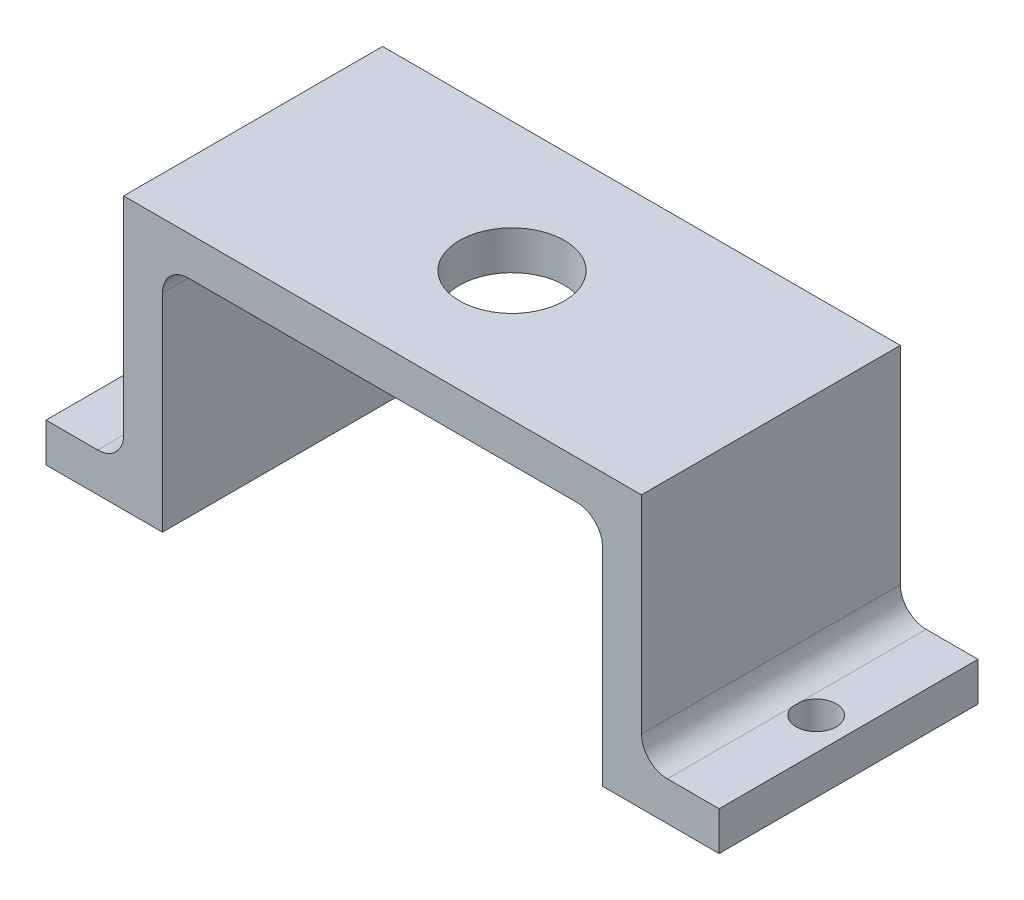
ISO-10303-21;
HEADER;
FILE_DESCRIPTION(('STEP AP214'),'2;1');
FILE_NAME('part.step','',(''),(''),'','','');
FILE_SCHEMA(('AUTOMOTIVE_DESIGN { 1 0 10303 214 1 1 1 1 }'));
ENDSEC;
DATA;
#1=APPLICATION_CONTEXT('core data for automotive mechanical design processes');
#2=APPLICATION_PROTOCOL_DEFINITION('international standard','automotive_design',2000,#1);
#3=PRODUCT_CONTEXT('',#1,'mechanical');
#4=PRODUCT('Part','Part','',(#3));
#5=PRODUCT_RELATED_PRODUCT_CATEGORY('part','',(#4));
#6=PRODUCT_DEFINITION_FORMATION('','',#4);
#7=PRODUCT_DEFINITION_CONTEXT('part definition',#1,'design');
#8=PRODUCT_DEFINITION('design','',#6,#7);
#9=PRODUCT_DEFINITION_SHAPE('','',#8);
#10=(LENGTH_UNIT() NAMED_UNIT(*) SI_UNIT(.MILLI.,.METRE.));
#11=(NAMED_UNIT(*) PLANE_ANGLE_UNIT() SI_UNIT($,.RADIAN.));
#12=(NAMED_UNIT(*) SI_UNIT($,.STERADIAN.) SOLID_ANGLE_UNIT());
#13=UNCERTAINTY_MEASURE_WITH_UNIT(LENGTH_MEASURE(1.E-05),#10,'distance_accuracy_value','');
#14=(GEOMETRIC_REPRESENTATION_CONTEXT(3) GLOBAL_UNCERTAINTY_ASSIGNED_CONTEXT((#13)) GLOBAL_UNIT_ASSIGNED_CONTEXT((#10,
#11,#12)) REPRESENTATION_CONTEXT('',''));
#15=CARTESIAN_POINT('',(0.,0.,0.));
#16=DIRECTION('',(0.,0.,1.));
#17=DIRECTION('',(1.,0.,0.));
#18=AXIS2_PLACEMENT_3D('',#15,#16,#17);
#19=CARTESIAN_POINT('',(-17.,9.13588483146066,20.));
#20=DIRECTION('',(-1.,0.,0.));
#21=DIRECTION('',(0.,-1.,0.));
#22=AXIS2_PLACEMENT_3D('',#19,#20,#21);
#23=PLANE('',#22);
#24=DIRECTION('',(0.,1.,0.));
#25=VECTOR('',#24,1.);
#26=CARTESIAN_POINT('',(-17.,9.13588483146066,0.));
#27=LINE('',#26,#25);
#28=CARTESIAN_POINT('',(-17.,-8.86411516853933,0.));
#29=VERTEX_POINT('',#28);
#30=CARTESIAN_POINT('',(-17.,7.13588483146066,0.));
#31=VERTEX_POINT('',#30);
#32=EDGE_CURVE('E251',#29,#31,#27,.T.);
#33=ORIENTED_EDGE('',*,*,#32,.T.);
#34=DIRECTION('',(0.,0.,-1.));
#35=VECTOR('',#34,1.);
#36=CARTESIAN_POINT('',(-17.,7.13588483146066,20.));
#37=LINE('',#36,#35);
#38=CARTESIAN_POINT('',(-17.,7.13588483146066,20.));
#39=VERTEX_POINT('',#38);
#40=EDGE_CURVE('E299',#31,#39,#37,.F.);
#41=ORIENTED_EDGE('',*,*,#40,.T.);
#42=DIRECTION('',(0.,1.,0.));
#43=VECTOR('',#42,1.);
#44=CARTESIAN_POINT('',(-17.,9.13588483146066,20.));
#45=LINE('',#44,#43);
#46=CARTESIAN_POINT('',(-17.,-8.86411516853933,20.));
#47=VERTEX_POINT('',#46);
#48=EDGE_CURVE('E274',#47,#39,#45,.T.);
#49=ORIENTED_EDGE('',*,*,#48,.F.);
#50=DIRECTION('',(0.,0.,-1.));
#51=VECTOR('',#50,1.);
#52=CARTESIAN_POINT('',(-17.,-8.86411516853933,20.));
#53=LINE('',#52,#51);
#54=EDGE_CURVE('E250',#47,#29,#53,.T.);
#55=ORIENTED_EDGE('',*,*,#54,.T.);
#56=EDGE_LOOP('',(#33,#41,#49,#55));
#57=FACE_BOUND('',#56,.T.);
#58=ADVANCED_FACE('F33',(#57),#23,.F.);
#59=CARTESIAN_POINT('',(17.,9.13588483146066,20.));
#60=DIRECTION('',(0.,1.,0.));
#61=DIRECTION('',(-1.,0.,0.));
#62=AXIS2_PLACEMENT_3D('',#59,#60,#61);
#63=PLANE('',#62);
#64=CARTESIAN_POINT('',(0.,9.13588483146066,10.));
#65=DIRECTION('',(0.,1.,0.));
#66=DIRECTION('',(-1.,0.,0.));
#67=AXIS2_PLACEMENT_3D('',#64,#65,#66);
#68=CIRCLE('',#67,4.05);
#69=CARTESIAN_POINT('',(-4.05,9.13588483146066,10.));
#70=VERTEX_POINT('',#69);
#71=EDGE_CURVE('E255',#70,#70,#68,.T.);
#72=ORIENTED_EDGE('',*,*,#71,.T.);
#73=EDGE_LOOP('',(#72));
#74=FACE_BOUND('',#73,.T.);
#75=DIRECTION('',(1.,0.,0.));
#76=VECTOR('',#75,1.);
#77=CARTESIAN_POINT('',(17.,9.13588483146066,20.));
#78=LINE('',#77,#76);
#79=CARTESIAN_POINT('',(-15.,9.13588483146066,20.));
#80=VERTEX_POINT('',#79);
#81=CARTESIAN_POINT('',(15.,9.13588483146066,20.));
#82=VERTEX_POINT('',#81);
#83=EDGE_CURVE('E523',#80,#82,#78,.T.);
#84=ORIENTED_EDGE('',*,*,#83,.F.);
#85=DIRECTION('',(0.,0.,-1.));
#86=VECTOR('',#85,1.);
#87=CARTESIAN_POINT('',(-15.,9.13588483146066,0.));
#88=LINE('',#87,#86);
#89=CARTESIAN_POINT('',(-15.,9.13588483146066,0.));
#90=VERTEX_POINT('',#89);
#91=EDGE_CURVE('E296',#80,#90,#88,.T.);
#92=ORIENTED_EDGE('',*,*,#91,.T.);
#93=DIRECTION('',(1.,0.,0.));
#94=VECTOR('',#93,1.);
#95=CARTESIAN_POINT('',(17.,9.13588483146066,0.));
#96=LINE('',#95,#94);
#97=CARTESIAN_POINT('',(15.,9.13588483146066,0.));
#98=VERTEX_POINT('',#97);
#99=EDGE_CURVE('E254',#90,#98,#96,.T.);
#100=ORIENTED_EDGE('',*,*,#99,.T.);
#101=DIRECTION('',(0.,0.,-1.));
#102=VECTOR('',#101,1.);
#103=CARTESIAN_POINT('',(15.,9.13588483146066,20.));
#104=LINE('',#103,#102);
#105=EDGE_CURVE('E294',#98,#82,#104,.F.);
#106=ORIENTED_EDGE('',*,*,#105,.T.);
#107=EDGE_LOOP('',(#84,#92,#100,#106));
#108=FACE_BOUND('',#107,.T.);
#109=ADVANCED_FACE('F350',(#74,#108),#63,.F.);
#110=CARTESIAN_POINT('',(17.,-8.86411516853933,20.));
#111=DIRECTION('',(1.,0.,0.));
#112=DIRECTION('',(0.,1.,0.));
#113=AXIS2_PLACEMENT_3D('',#110,#111,#112);
#114=PLANE('',#113);
#115=DIRECTION('',(0.,-1.,0.));
#116=VECTOR('',#115,1.);
#117=CARTESIAN_POINT('',(17.,-8.86411516853933,20.));
#118=LINE('',#117,#116);
#119=CARTESIAN_POINT('',(17.,7.13588483146066,20.));
#120=VERTEX_POINT('',#119);
#121=CARTESIAN_POINT('',(17.,-8.86411516853933,20.));
#122=VERTEX_POINT('',#121);
#123=EDGE_CURVE('E308',#120,#122,#118,.T.);
#124=ORIENTED_EDGE('',*,*,#123,.F.);
#125=DIRECTION('',(0.,0.,-1.));
#126=VECTOR('',#125,1.);
#127=CARTESIAN_POINT('',(17.,7.13588483146066,0.));
#128=LINE('',#127,#126);
#129=CARTESIAN_POINT('',(17.,7.13588483146066,0.));
#130=VERTEX_POINT('',#129);
#131=EDGE_CURVE('E182',#120,#130,#128,.T.);
#132=ORIENTED_EDGE('',*,*,#131,.T.);
#133=DIRECTION('',(0.,-1.,0.));
#134=VECTOR('',#133,1.);
#135=CARTESIAN_POINT('',(17.,-8.86411516853933,0.));
#136=LINE('',#135,#134);
#137=CARTESIAN_POINT('',(17.,-8.86411516853933,0.));
#138=VERTEX_POINT('',#137);
#139=EDGE_CURVE('E258',#130,#138,#136,.T.);
#140=ORIENTED_EDGE('',*,*,#139,.T.);
#141=DIRECTION('',(0.,0.,-1.));
#142=VECTOR('',#141,1.);
#143=CARTESIAN_POINT('',(17.,-8.86411516853933,20.));
#144=LINE('',#143,#142);
#145=EDGE_CURVE('E291',#122,#138,#144,.T.);
#146=ORIENTED_EDGE('',*,*,#145,.F.);
#147=EDGE_LOOP('',(#124,#132,#140,#146));
#148=FACE_BOUND('',#147,.T.);
#149=ADVANCED_FACE('F306',(#148),#114,.F.);
#150=CARTESIAN_POINT('',(26.,-8.86411516853933,20.));
#151=DIRECTION('',(0.,1.,0.));
#152=DIRECTION('',(-1.,0.,0.));
#153=AXIS2_PLACEMENT_3D('',#150,#151,#152);
#154=PLANE('',#153);
#155=CARTESIAN_POINT('',(23.5,-8.86411516853933,10.));
#156=DIRECTION('',(0.,1.,0.));
#157=DIRECTION('',(-1.,0.,0.));
#158=AXIS2_PLACEMENT_3D('',#155,#156,#157);
#159=CIRCLE('',#158,1.55);
#160=CARTESIAN_POINT('',(21.95,-8.86411516853933,10.));
#161=VERTEX_POINT('',#160);
#162=EDGE_CURVE('E169',#161,#161,#159,.T.);
#163=ORIENTED_EDGE('',*,*,#162,.T.);
#164=EDGE_LOOP('',(#163));
#165=FACE_BOUND('',#164,.T.);
#166=DIRECTION('',(1.,0.,0.));
#167=VECTOR('',#166,1.);
#168=CARTESIAN_POINT('',(26.,-8.86411516853933,0.));
#169=LINE('',#168,#167);
#170=CARTESIAN_POINT('',(26.,-8.86411516853933,0.));
#171=VERTEX_POINT('',#170);
#172=EDGE_CURVE('E260',#138,#171,#169,.T.);
#173=ORIENTED_EDGE('',*,*,#172,.T.);
#174=DIRECTION('',(0.,0.,-1.));
#175=VECTOR('',#174,1.);
#176=CARTESIAN_POINT('',(26.,-8.86411516853933,20.));
#177=LINE('',#176,#175);
#178=CARTESIAN_POINT('',(26.,-8.86411516853933,20.));
#179=VERTEX_POINT('',#178);
#180=EDGE_CURVE('E288',#179,#171,#177,.T.);
#181=ORIENTED_EDGE('',*,*,#180,.F.);
#182=DIRECTION('',(1.,0.,0.));
#183=VECTOR('',#182,1.);
#184=CARTESIAN_POINT('',(26.,-8.86411516853933,20.));
#185=LINE('',#184,#183);
#186=EDGE_CURVE('E325',#122,#179,#185,.T.);
#187=ORIENTED_EDGE('',*,*,#186,.F.);
#188=ORIENTED_EDGE('',*,*,#145,.T.);
#189=EDGE_LOOP('',(#173,#181,#187,#188));
#190=FACE_BOUND('',#189,.T.);
#191=ADVANCED_FACE('F317',(#165,#190),#154,.F.);
#192=CARTESIAN_POINT('',(26.,-5.86411516853933,20.));
#193=DIRECTION('',(-1.,0.,0.));
#194=DIRECTION('',(0.,0.,1.));
#195=AXIS2_PLACEMENT_3D('',#192,#193,#194);
#196=PLANE('',#195);
#197=DIRECTION('',(0.,1.,0.));
#198=VECTOR('',#197,1.);
#199=CARTESIAN_POINT('',(26.,-5.86411516853933,0.));
#200=LINE('',#199,#198);
#201=CARTESIAN_POINT('',(26.,-5.86411516853933,0.));
#202=VERTEX_POINT('',#201);
#203=EDGE_CURVE('E262',#171,#202,#200,.T.);
#204=ORIENTED_EDGE('',*,*,#203,.T.);
#205=DIRECTION('',(0.,0.,-1.));
#206=VECTOR('',#205,1.);
#207=CARTESIAN_POINT('',(26.,-5.86411516853933,20.));
#208=LINE('',#207,#206);
#209=CARTESIAN_POINT('',(26.,-5.86411516853933,20.));
#210=VERTEX_POINT('',#209);
#211=EDGE_CURVE('E285',#210,#202,#208,.T.);
#212=ORIENTED_EDGE('',*,*,#211,.F.);
#213=DIRECTION('',(0.,1.,0.));
#214=VECTOR('',#213,1.);
#215=CARTESIAN_POINT('',(26.,-5.86411516853933,20.));
#216=LINE('',#215,#214);
#217=EDGE_CURVE('E323',#179,#210,#216,.T.);
#218=ORIENTED_EDGE('',*,*,#217,.F.);
#219=ORIENTED_EDGE('',*,*,#180,.T.);
#220=EDGE_LOOP('',(#204,#212,#218,#219));
#221=FACE_BOUND('',#220,.T.);
#222=ADVANCED_FACE('F321',(#221),#196,.F.);
#223=CARTESIAN_POINT('',(20.,-5.86411516853933,20.));
#224=DIRECTION('',(0.,-1.,0.));
#225=DIRECTION('',(0.,0.,-1.));
#226=AXIS2_PLACEMENT_3D('',#223,#224,#225);
#227=PLANE('',#226);
#228=DIRECTION('',(0.,0.,-1.));
#229=VECTOR('',#228,1.);
#230=CARTESIAN_POINT('',(22.,-5.86411516853933,20.));
#231=LINE('',#230,#229);
#232=CARTESIAN_POINT('',(22.,-5.86411516853933,0.));
#233=VERTEX_POINT('',#232);
#234=CARTESIAN_POINT('',(22.,-5.86411516853933,9.60948751620467));
#235=VERTEX_POINT('',#234);
#236=EDGE_CURVE('E161',#233,#235,#231,.F.);
#237=ORIENTED_EDGE('',*,*,#236,.T.);
#238=CARTESIAN_POINT('',(23.5,-5.86411516853933,10.));
#239=DIRECTION('',(0.,1.,0.));
#240=DIRECTION('',(0.,0.,1.));
#241=AXIS2_PLACEMENT_3D('',#238,#239,#240);
#242=CIRCLE('',#241,1.55);
#243=CARTESIAN_POINT('',(22.,-5.86411516853933,10.3905124837953));
#244=VERTEX_POINT('',#243);
#245=EDGE_CURVE('E168',#244,#235,#242,.T.);
#246=ORIENTED_EDGE('',*,*,#245,.F.);
#247=CARTESIAN_POINT('',(22.,-5.86411516853933,20.));
#248=VERTEX_POINT('',#247);
#249=EDGE_CURVE('E162',#244,#248,#231,.F.);
#250=ORIENTED_EDGE('',*,*,#249,.T.);
#251=DIRECTION('',(-1.,0.,0.));
#252=VECTOR('',#251,1.);
#253=CARTESIAN_POINT('',(20.,-5.86411516853933,20.));
#254=LINE('',#253,#252);
#255=EDGE_CURVE('E324',#210,#248,#254,.T.);
#256=ORIENTED_EDGE('',*,*,#255,.F.);
#257=ORIENTED_EDGE('',*,*,#211,.T.);
#258=DIRECTION('',(-1.,0.,0.));
#259=VECTOR('',#258,1.);
#260=CARTESIAN_POINT('',(20.,-5.86411516853933,0.));
#261=LINE('',#260,#259);
#262=EDGE_CURVE('E264',#202,#233,#261,.T.);
#263=ORIENTED_EDGE('',*,*,#262,.T.);
#264=EDGE_LOOP('',(#237,#246,#250,#256,#257,#263));
#265=FACE_BOUND('',#264,.T.);
#266=ADVANCED_FACE('F172',(#265),#227,.F.);
#267=CARTESIAN_POINT('',(20.,12.1358848314607,20.));
#268=DIRECTION('',(-1.,0.,0.));
#269=DIRECTION('',(0.,-1.,0.));
#270=AXIS2_PLACEMENT_3D('',#267,#268,#269);
#271=PLANE('',#270);
#272=DIRECTION('',(0.,1.,0.));
#273=VECTOR('',#272,1.);
#274=CARTESIAN_POINT('',(20.,12.1358848314607,20.));
#275=LINE('',#274,#273);
#276=CARTESIAN_POINT('',(20.,-3.86411516853933,20.));
#277=VERTEX_POINT('',#276);
#278=CARTESIAN_POINT('',(20.,12.1358848314607,20.));
#279=VERTEX_POINT('',#278);
#280=EDGE_CURVE('E327',#277,#279,#275,.T.);
#281=ORIENTED_EDGE('',*,*,#280,.F.);
#282=DIRECTION('',(0.,0.,-1.));
#283=VECTOR('',#282,1.);
#284=CARTESIAN_POINT('',(20.,-3.86411516853933,0.));
#285=LINE('',#284,#283);
#286=CARTESIAN_POINT('',(20.,-3.86411516853933,0.));
#287=VERTEX_POINT('',#286);
#288=EDGE_CURVE('E180',#277,#287,#285,.T.);
#289=ORIENTED_EDGE('',*,*,#288,.T.);
#290=DIRECTION('',(0.,1.,0.));
#291=VECTOR('',#290,1.);
#292=CARTESIAN_POINT('',(20.,12.1358848314607,0.));
#293=LINE('',#292,#291);
#294=CARTESIAN_POINT('',(20.,12.1358848314607,0.));
#295=VERTEX_POINT('',#294);
#296=EDGE_CURVE('E266',#287,#295,#293,.T.);
#297=ORIENTED_EDGE('',*,*,#296,.T.);
#298=DIRECTION('',(0.,0.,-1.));
#299=VECTOR('',#298,1.);
#300=CARTESIAN_POINT('',(20.,12.1358848314607,20.));
#301=LINE('',#300,#299);
#302=EDGE_CURVE('E282',#279,#295,#301,.T.);
#303=ORIENTED_EDGE('',*,*,#302,.F.);
#304=EDGE_LOOP('',(#281,#289,#297,#303));
#305=FACE_BOUND('',#304,.T.);
#306=ADVANCED_FACE('F339',(#305),#271,.F.);
#307=CARTESIAN_POINT('',(-20.,12.1358848314607,20.));
#308=DIRECTION('',(0.,-1.,0.));
#309=DIRECTION('',(0.,0.,-1.));
#310=AXIS2_PLACEMENT_3D('',#307,#308,#309);
#311=PLANE('',#310);
#312=CARTESIAN_POINT('',(0.,12.1358848314607,10.));
#313=DIRECTION('',(0.,1.,0.));
#314=DIRECTION('',(0.,0.,1.));
#315=AXIS2_PLACEMENT_3D('',#312,#313,#314);
#316=CIRCLE('',#315,4.05);
#317=CARTESIAN_POINT('',(0.,12.1358848314607,14.05));
#318=VERTEX_POINT('',#317);
#319=EDGE_CURVE('E517',#318,#318,#316,.T.);
#320=ORIENTED_EDGE('',*,*,#319,.F.);
#321=EDGE_LOOP('',(#320));
#322=FACE_BOUND('',#321,.T.);
#323=DIRECTION('',(-1.,0.,0.));
#324=VECTOR('',#323,1.);
#325=CARTESIAN_POINT('',(-20.,12.1358848314607,0.));
#326=LINE('',#325,#324);
#327=CARTESIAN_POINT('',(-20.,12.1358848314607,0.));
#328=VERTEX_POINT('',#327);
#329=EDGE_CURVE('E227',#295,#328,#326,.T.);
#330=ORIENTED_EDGE('',*,*,#329,.T.);
#331=DIRECTION('',(0.,0.,-1.));
#332=VECTOR('',#331,1.);
#333=CARTESIAN_POINT('',(-20.,12.1358848314607,20.));
#334=LINE('',#333,#332);
#335=CARTESIAN_POINT('',(-20.,12.1358848314607,20.));
#336=VERTEX_POINT('',#335);
#337=EDGE_CURVE('E226',#336,#328,#334,.T.);
#338=ORIENTED_EDGE('',*,*,#337,.F.);
#339=DIRECTION('',(-1.,0.,0.));
#340=VECTOR('',#339,1.);
#341=CARTESIAN_POINT('',(-20.,12.1358848314607,20.));
#342=LINE('',#341,#340);
#343=EDGE_CURVE('E245',#279,#336,#342,.T.);
#344=ORIENTED_EDGE('',*,*,#343,.F.);
#345=ORIENTED_EDGE('',*,*,#302,.T.);
#346=EDGE_LOOP('',(#330,#338,#344,#345));
#347=FACE_BOUND('',#346,.T.);
#348=ADVANCED_FACE('F336',(#322,#347),#311,.F.);
#349=CARTESIAN_POINT('',(-20.,-5.86411516853933,20.));
#350=DIRECTION('',(1.,0.,0.));
#351=DIRECTION('',(0.,0.,-1.));
#352=AXIS2_PLACEMENT_3D('',#349,#350,#351);
#353=PLANE('',#352);
#354=DIRECTION('',(0.,-1.,0.));
#355=VECTOR('',#354,1.);
#356=CARTESIAN_POINT('',(-20.,-5.86411516853933,0.));
#357=LINE('',#356,#355);
#358=CARTESIAN_POINT('',(-20.,-3.86411516853933,0.));
#359=VERTEX_POINT('',#358);
#360=EDGE_CURVE('E219',#328,#359,#357,.T.);
#361=ORIENTED_EDGE('',*,*,#360,.T.);
#362=DIRECTION('',(0.,0.,-1.));
#363=VECTOR('',#362,1.);
#364=CARTESIAN_POINT('',(-20.,-3.86411516853933,20.));
#365=LINE('',#364,#363);
#366=CARTESIAN_POINT('',(-20.,-3.86411516853933,20.));
#367=VERTEX_POINT('',#366);
#368=EDGE_CURVE('E194',#359,#367,#365,.F.);
#369=ORIENTED_EDGE('',*,*,#368,.T.);
#370=DIRECTION('',(0.,-1.,0.));
#371=VECTOR('',#370,1.);
#372=CARTESIAN_POINT('',(-20.,-5.86411516853933,20.));
#373=LINE('',#372,#371);
#374=EDGE_CURVE('E236',#336,#367,#373,.T.);
#375=ORIENTED_EDGE('',*,*,#374,.F.);
#376=ORIENTED_EDGE('',*,*,#337,.T.);
#377=EDGE_LOOP('',(#361,#369,#375,#376));
#378=FACE_BOUND('',#377,.T.);
#379=ADVANCED_FACE('F224',(#378),#353,.F.);
#380=CARTESIAN_POINT('',(-26.,-5.86411516853933,20.));
#381=DIRECTION('',(0.,-1.,0.));
#382=DIRECTION('',(0.,0.,-1.));
#383=AXIS2_PLACEMENT_3D('',#380,#381,#382);
#384=PLANE('',#383);
#385=DIRECTION('',(0.,0.,-1.));
#386=VECTOR('',#385,1.);
#387=CARTESIAN_POINT('',(-22.,-5.86411516853933,0.));
#388=LINE('',#387,#386);
#389=CARTESIAN_POINT('',(-22.,-5.86411516853933,20.));
#390=VERTEX_POINT('',#389);
#391=CARTESIAN_POINT('',(-22.,-5.86411516853933,10.3905124837953));
#392=VERTEX_POINT('',#391);
#393=EDGE_CURVE('E187',#390,#392,#388,.T.);
#394=ORIENTED_EDGE('',*,*,#393,.T.);
#395=CARTESIAN_POINT('',(-23.5,-5.86411516853933,10.));
#396=DIRECTION('',(0.,1.,0.));
#397=DIRECTION('',(0.,0.,1.));
#398=AXIS2_PLACEMENT_3D('',#395,#396,#397);
#399=CIRCLE('',#398,1.55);
#400=CARTESIAN_POINT('',(-22.,-5.86411516853933,9.6094875162047));
#401=VERTEX_POINT('',#400);
#402=EDGE_CURVE('E510',#401,#392,#399,.T.);
#403=ORIENTED_EDGE('',*,*,#402,.F.);
#404=CARTESIAN_POINT('',(-22.,-5.86411516853933,0.));
#405=VERTEX_POINT('',#404);
#406=EDGE_CURVE('E185',#401,#405,#388,.T.);
#407=ORIENTED_EDGE('',*,*,#406,.T.);
#408=DIRECTION('',(-1.,0.,0.));
#409=VECTOR('',#408,1.);
#410=CARTESIAN_POINT('',(-26.,-5.86411516853933,0.));
#411=LINE('',#410,#409);
#412=CARTESIAN_POINT('',(-26.,-5.86411516853933,0.));
#413=VERTEX_POINT('',#412);
#414=EDGE_CURVE('E221',#405,#413,#411,.T.);
#415=ORIENTED_EDGE('',*,*,#414,.T.);
#416=DIRECTION('',(0.,0.,-1.));
#417=VECTOR('',#416,1.);
#418=CARTESIAN_POINT('',(-26.,-5.86411516853933,20.));
#419=LINE('',#418,#417);
#420=CARTESIAN_POINT('',(-26.,-5.86411516853933,20.));
#421=VERTEX_POINT('',#420);
#422=EDGE_CURVE('E239',#421,#413,#419,.T.);
#423=ORIENTED_EDGE('',*,*,#422,.F.);
#424=DIRECTION('',(-1.,0.,0.));
#425=VECTOR('',#424,1.);
#426=CARTESIAN_POINT('',(-26.,-5.86411516853933,20.));
#427=LINE('',#426,#425);
#428=EDGE_CURVE('E234',#390,#421,#427,.T.);
#429=ORIENTED_EDGE('',*,*,#428,.F.);
#430=EDGE_LOOP('',(#394,#403,#407,#415,#423,#429));
#431=FACE_BOUND('',#430,.T.);
#432=ADVANCED_FACE('F237',(#431),#384,.F.);
#433=CARTESIAN_POINT('',(-26.,-8.86411516853933,20.));
#434=DIRECTION('',(1.,0.,0.));
#435=DIRECTION('',(0.,0.,-1.));
#436=AXIS2_PLACEMENT_3D('',#433,#434,#435);
#437=PLANE('',#436);
#438=DIRECTION('',(0.,-1.,0.));
#439=VECTOR('',#438,1.);
#440=CARTESIAN_POINT('',(-26.,-8.86411516853933,0.));
#441=LINE('',#440,#439);
#442=CARTESIAN_POINT('',(-26.,-8.86411516853933,0.));
#443=VERTEX_POINT('',#442);
#444=EDGE_CURVE('E270',#413,#443,#441,.T.);
#445=ORIENTED_EDGE('',*,*,#444,.T.);
#446=DIRECTION('',(0.,0.,-1.));
#447=VECTOR('',#446,1.);
#448=CARTESIAN_POINT('',(-26.,-8.86411516853933,20.));
#449=LINE('',#448,#447);
#450=CARTESIAN_POINT('',(-26.,-8.86411516853933,20.));
#451=VERTEX_POINT('',#450);
#452=EDGE_CURVE('E277',#451,#443,#449,.T.);
#453=ORIENTED_EDGE('',*,*,#452,.F.);
#454=DIRECTION('',(0.,-1.,0.));
#455=VECTOR('',#454,1.);
#456=CARTESIAN_POINT('',(-26.,-8.86411516853933,20.));
#457=LINE('',#456,#455);
#458=EDGE_CURVE('E241',#421,#451,#457,.T.);
#459=ORIENTED_EDGE('',*,*,#458,.F.);
#460=ORIENTED_EDGE('',*,*,#422,.T.);
#461=EDGE_LOOP('',(#445,#453,#459,#460));
#462=FACE_BOUND('',#461,.T.);
#463=ADVANCED_FACE('F395',(#462),#437,.F.);
#464=CARTESIAN_POINT('',(-17.,-8.86411516853933,20.));
#465=DIRECTION('',(0.,1.,0.));
#466=DIRECTION('',(-1.,0.,0.));
#467=AXIS2_PLACEMENT_3D('',#464,#465,#466);
#468=PLANE('',#467);
#469=CARTESIAN_POINT('',(-23.5,-8.86411516853933,10.));
#470=DIRECTION('',(0.,1.,0.));
#471=DIRECTION('',(-1.,0.,0.));
#472=AXIS2_PLACEMENT_3D('',#469,#470,#471);
#473=CIRCLE('',#472,1.55);
#474=CARTESIAN_POINT('',(-25.05,-8.86411516853933,10.));
#475=VERTEX_POINT('',#474);
#476=EDGE_CURVE('E514',#475,#475,#473,.T.);
#477=ORIENTED_EDGE('',*,*,#476,.T.);
#478=EDGE_LOOP('',(#477));
#479=FACE_BOUND('',#478,.T.);
#480=DIRECTION('',(1.,0.,0.));
#481=VECTOR('',#480,1.);
#482=CARTESIAN_POINT('',(-17.,-8.86411516853933,0.));
#483=LINE('',#482,#481);
#484=EDGE_CURVE('E272',#443,#29,#483,.T.);
#485=ORIENTED_EDGE('',*,*,#484,.T.);
#486=ORIENTED_EDGE('',*,*,#54,.F.);
#487=DIRECTION('',(1.,0.,0.));
#488=VECTOR('',#487,1.);
#489=CARTESIAN_POINT('',(-17.,-8.86411516853933,20.));
#490=LINE('',#489,#488);
#491=EDGE_CURVE('E243',#451,#47,#490,.T.);
#492=ORIENTED_EDGE('',*,*,#491,.F.);
#493=ORIENTED_EDGE('',*,*,#452,.T.);
#494=EDGE_LOOP('',(#485,#486,#492,#493));
#495=FACE_BOUND('',#494,.T.);
#496=ADVANCED_FACE('F390',(#479,#495),#468,.F.);
#497=CARTESIAN_POINT('',(0.,0.,20.));
#498=DIRECTION('',(0.,0.,-1.));
#499=DIRECTION('',(-1.,0.,0.));
#500=AXIS2_PLACEMENT_3D('',#497,#498,#499);
#501=PLANE('',#500);
#502=ORIENTED_EDGE('',*,*,#48,.T.);
#503=CARTESIAN_POINT('',(-15.,7.13588483146066,20.));
#504=DIRECTION('',(0.,0.,-1.));
#505=DIRECTION('',(-1.,0.,0.));
#506=AXIS2_PLACEMENT_3D('',#503,#504,#505);
#507=CIRCLE('',#506,2.);
#508=EDGE_CURVE('E203',#39,#80,#507,.T.);
#509=ORIENTED_EDGE('',*,*,#508,.T.);
#510=ORIENTED_EDGE('',*,*,#83,.T.);
#511=CARTESIAN_POINT('',(15.,7.13588483146066,20.));
#512=DIRECTION('',(0.,0.,-1.));
#513=DIRECTION('',(-1.,0.,0.));
#514=AXIS2_PLACEMENT_3D('',#511,#512,#513);
#515=CIRCLE('',#514,2.);
#516=EDGE_CURVE('E209',#82,#120,#515,.T.);
#517=ORIENTED_EDGE('',*,*,#516,.T.);
#518=ORIENTED_EDGE('',*,*,#123,.T.);
#519=ORIENTED_EDGE('',*,*,#186,.T.);
#520=ORIENTED_EDGE('',*,*,#217,.T.);
#521=ORIENTED_EDGE('',*,*,#255,.T.);
#522=CARTESIAN_POINT('',(22.,-3.86411516853933,20.));
#523=DIRECTION('',(0.,0.,-1.));
#524=DIRECTION('',(-1.,0.,0.));
#525=AXIS2_PLACEMENT_3D('',#522,#523,#524);
#526=CIRCLE('',#525,2.);
#527=EDGE_CURVE('E179',#248,#277,#526,.T.);
#528=ORIENTED_EDGE('',*,*,#527,.T.);
#529=ORIENTED_EDGE('',*,*,#280,.T.);
#530=ORIENTED_EDGE('',*,*,#343,.T.);
#531=ORIENTED_EDGE('',*,*,#374,.T.);
#532=CARTESIAN_POINT('',(-22.,-3.86411516853933,20.));
#533=DIRECTION('',(0.,0.,-1.));
#534=DIRECTION('',(-1.,0.,0.));
#535=AXIS2_PLACEMENT_3D('',#532,#533,#534);
#536=CIRCLE('',#535,2.);
#537=EDGE_CURVE('E11',#367,#390,#536,.T.);
#538=ORIENTED_EDGE('',*,*,#537,.T.);
#539=ORIENTED_EDGE('',*,*,#428,.T.);
#540=ORIENTED_EDGE('',*,*,#458,.T.);
#541=ORIENTED_EDGE('',*,*,#491,.T.);
#542=EDGE_LOOP('',(#502,#509,#510,#517,#518,#519,#520,#521,#528,#529,#530,#531,#538,#539,#540,#541));
#543=FACE_BOUND('',#542,.T.);
#544=ADVANCED_FACE('F233',(#543),#501,.F.);
#545=CARTESIAN_POINT('',(0.,0.,0.));
#546=DIRECTION('',(0.,0.,-1.));
#547=DIRECTION('',(-1.,0.,0.));
#548=AXIS2_PLACEMENT_3D('',#545,#546,#547);
#549=PLANE('',#548);
#550=ORIENTED_EDGE('',*,*,#32,.F.);
#551=ORIENTED_EDGE('',*,*,#484,.F.);
#552=ORIENTED_EDGE('',*,*,#444,.F.);
#553=ORIENTED_EDGE('',*,*,#414,.F.);
#554=CARTESIAN_POINT('',(-22.,-3.86411516853933,0.));
#555=DIRECTION('',(0.,0.,-1.));
#556=DIRECTION('',(-1.,0.,0.));
#557=AXIS2_PLACEMENT_3D('',#554,#555,#556);
#558=CIRCLE('',#557,2.);
#559=EDGE_CURVE('E41',#405,#359,#558,.F.);
#560=ORIENTED_EDGE('',*,*,#559,.T.);
#561=ORIENTED_EDGE('',*,*,#360,.F.);
#562=ORIENTED_EDGE('',*,*,#329,.F.);
#563=ORIENTED_EDGE('',*,*,#296,.F.);
#564=CARTESIAN_POINT('',(22.,-3.86411516853933,0.));
#565=DIRECTION('',(0.,0.,-1.));
#566=DIRECTION('',(-1.,0.,0.));
#567=AXIS2_PLACEMENT_3D('',#564,#565,#566);
#568=CIRCLE('',#567,2.);
#569=EDGE_CURVE('E211',#287,#233,#568,.F.);
#570=ORIENTED_EDGE('',*,*,#569,.T.);
#571=ORIENTED_EDGE('',*,*,#262,.F.);
#572=ORIENTED_EDGE('',*,*,#203,.F.);
#573=ORIENTED_EDGE('',*,*,#172,.F.);
#574=ORIENTED_EDGE('',*,*,#139,.F.);
#575=CARTESIAN_POINT('',(15.,7.13588483146066,0.));
#576=DIRECTION('',(0.,0.,-1.));
#577=DIRECTION('',(-1.,0.,0.));
#578=AXIS2_PLACEMENT_3D('',#575,#576,#577);
#579=CIRCLE('',#578,2.);
#580=EDGE_CURVE('E207',#130,#98,#579,.F.);
#581=ORIENTED_EDGE('',*,*,#580,.T.);
#582=ORIENTED_EDGE('',*,*,#99,.F.);
#583=CARTESIAN_POINT('',(-15.,7.13588483146066,0.));
#584=DIRECTION('',(0.,0.,-1.));
#585=DIRECTION('',(-1.,0.,0.));
#586=AXIS2_PLACEMENT_3D('',#583,#584,#585);
#587=CIRCLE('',#586,2.);
#588=EDGE_CURVE('E197',#90,#31,#587,.F.);
#589=ORIENTED_EDGE('',*,*,#588,.T.);
#590=EDGE_LOOP('',(#550,#551,#552,#553,#560,#561,#562,#563,#570,#571,#572,#573,#574,#581,#582,#589));
#591=FACE_BOUND('',#590,.T.);
#592=ADVANCED_FACE('F217',(#591),#549,.T.);
#593=CARTESIAN_POINT('',(0.,-3.86411516853934,10.));
#594=DIRECTION('',(0.,1.,0.));
#595=DIRECTION('',(0.,0.,1.));
#596=AXIS2_PLACEMENT_3D('',#593,#594,#595);
#597=CYLINDRICAL_SURFACE('',#596,4.05);
#598=ORIENTED_EDGE('',*,*,#319,.T.);
#599=EDGE_LOOP('',(#598));
#600=FACE_BOUND('',#599,.T.);
#601=ORIENTED_EDGE('',*,*,#71,.F.);
#602=EDGE_LOOP('',(#601));
#603=FACE_BOUND('',#602,.T.);
#604=ADVANCED_FACE('F364',(#600,#603),#597,.F.);
#605=CARTESIAN_POINT('',(-15.,7.13588483146066,20.));
#606=DIRECTION('',(0.,0.,1.));
#607=DIRECTION('',(1.,0.,0.));
#608=AXIS2_PLACEMENT_3D('',#605,#606,#607);
#609=CYLINDRICAL_SURFACE('',#608,2.);
#610=ORIENTED_EDGE('',*,*,#508,.F.);
#611=ORIENTED_EDGE('',*,*,#40,.F.);
#612=ORIENTED_EDGE('',*,*,#588,.F.);
#613=ORIENTED_EDGE('',*,*,#91,.F.);
#614=EDGE_LOOP('',(#610,#611,#612,#613));
#615=FACE_BOUND('',#614,.T.);
#616=ADVANCED_FACE('F360',(#615),#609,.F.);
#617=CARTESIAN_POINT('',(15.,7.13588483146066,20.));
#618=DIRECTION('',(0.,0.,1.));
#619=DIRECTION('',(1.,0.,0.));
#620=AXIS2_PLACEMENT_3D('',#617,#618,#619);
#621=CYLINDRICAL_SURFACE('',#620,2.);
#622=ORIENTED_EDGE('',*,*,#516,.F.);
#623=ORIENTED_EDGE('',*,*,#105,.F.);
#624=ORIENTED_EDGE('',*,*,#580,.F.);
#625=ORIENTED_EDGE('',*,*,#131,.F.);
#626=EDGE_LOOP('',(#622,#623,#624,#625));
#627=FACE_BOUND('',#626,.T.);
#628=ADVANCED_FACE('F363',(#627),#621,.F.);
#629=CARTESIAN_POINT('',(22.,-3.86411516853933,20.));
#630=DIRECTION('',(0.,0.,1.));
#631=DIRECTION('',(1.,0.,0.));
#632=AXIS2_PLACEMENT_3D('',#629,#630,#631);
#633=CYLINDRICAL_SURFACE('',#632,2.);
#634=ORIENTED_EDGE('',*,*,#527,.F.);
#635=ORIENTED_EDGE('',*,*,#249,.F.);
#636=EDGE_CURVE('E155',#235,#244,#231,.F.);
#637=ORIENTED_EDGE('',*,*,#636,.F.);
#638=ORIENTED_EDGE('',*,*,#236,.F.);
#639=ORIENTED_EDGE('',*,*,#569,.F.);
#640=ORIENTED_EDGE('',*,*,#288,.F.);
#641=EDGE_LOOP('',(#634,#635,#637,#638,#639,#640));
#642=FACE_BOUND('',#641,.T.);
#643=ADVANCED_FACE('F177',(#642),#633,.F.);
#644=CARTESIAN_POINT('',(-22.,-3.86411516853933,20.));
#645=DIRECTION('',(0.,0.,1.));
#646=DIRECTION('',(1.,0.,0.));
#647=AXIS2_PLACEMENT_3D('',#644,#645,#646);
#648=CYLINDRICAL_SURFACE('',#647,2.);
#649=ORIENTED_EDGE('',*,*,#537,.F.);
#650=ORIENTED_EDGE('',*,*,#368,.F.);
#651=ORIENTED_EDGE('',*,*,#559,.F.);
#652=ORIENTED_EDGE('',*,*,#406,.F.);
#653=EDGE_CURVE('E186',#392,#401,#388,.T.);
#654=ORIENTED_EDGE('',*,*,#653,.F.);
#655=ORIENTED_EDGE('',*,*,#393,.F.);
#656=EDGE_LOOP('',(#649,#650,#651,#652,#654,#655));
#657=FACE_BOUND('',#656,.T.);
#658=ADVANCED_FACE('F35',(#657),#648,.F.);
#659=CARTESIAN_POINT('',(-23.5,-21.8641151685393,10.));
#660=DIRECTION('',(0.,1.,0.));
#661=DIRECTION('',(0.,0.,1.));
#662=AXIS2_PLACEMENT_3D('',#659,#660,#661);
#663=CYLINDRICAL_SURFACE('',#662,1.55);
#664=EDGE_CURVE('E54',#392,#401,#399,.T.);
#665=ORIENTED_EDGE('',*,*,#664,.T.);
#666=ORIENTED_EDGE('',*,*,#402,.T.);
#667=EDGE_LOOP('',(#665,#666));
#668=FACE_BOUND('',#667,.T.);
#669=ORIENTED_EDGE('',*,*,#476,.F.);
#670=EDGE_LOOP('',(#669));
#671=FACE_BOUND('',#670,.T.);
#672=ADVANCED_FACE('F371',(#668,#671),#663,.F.);
#673=CARTESIAN_POINT('',(-23.5,-5.86411516853933,10.));
#674=DIRECTION('',(0.,1.,0.));
#675=DIRECTION('',(0.,0.,1.));
#676=AXIS2_PLACEMENT_3D('',#673,#674,#675);
#677=PLANE('',#676);
#678=ORIENTED_EDGE('',*,*,#653,.T.);
#679=ORIENTED_EDGE('',*,*,#664,.F.);
#680=EDGE_LOOP('',(#678,#679));
#681=FACE_BOUND('',#680,.T.);
#682=ADVANCED_FACE('F375',(#681),#677,.F.);
#683=CARTESIAN_POINT('',(23.5,-21.8641151685393,10.));
#684=DIRECTION('',(0.,1.,0.));
#685=DIRECTION('',(0.,0.,1.));
#686=AXIS2_PLACEMENT_3D('',#683,#684,#685);
#687=CYLINDRICAL_SURFACE('',#686,1.55);
#688=EDGE_CURVE('E47',#235,#244,#242,.T.);
#689=ORIENTED_EDGE('',*,*,#688,.T.);
#690=ORIENTED_EDGE('',*,*,#245,.T.);
#691=EDGE_LOOP('',(#689,#690));
#692=FACE_BOUND('',#691,.T.);
#693=ORIENTED_EDGE('',*,*,#162,.F.);
#694=EDGE_LOOP('',(#693));
#695=FACE_BOUND('',#694,.T.);
#696=ADVANCED_FACE('F166',(#692,#695),#687,.F.);
#697=CARTESIAN_POINT('',(23.5,-5.86411516853933,10.));
#698=DIRECTION('',(0.,1.,0.));
#699=DIRECTION('',(0.,0.,1.));
#700=AXIS2_PLACEMENT_3D('',#697,#698,#699);
#701=PLANE('',#700);
#702=ORIENTED_EDGE('',*,*,#688,.F.);
#703=ORIENTED_EDGE('',*,*,#636,.T.);
#704=EDGE_LOOP('',(#702,#703));
#705=FACE_BOUND('',#704,.T.);
#706=ADVANCED_FACE('F156',(#705),#701,.F.);
#707=CLOSED_SHELL('',(#58,#109,#149,#191,#222,#266,#306,#348,#379,#432,#463,#496,#544,#592,#604,
#616,#628,#643,#658,#672,#682,#696,#706));
#708=MANIFOLD_SOLID_BREP('B2',#707);
#709=ADVANCED_BREP_SHAPE_REPRESENTATION('',(#18,#708),#14);
#710=SHAPE_DEFINITION_REPRESENTATION(#9,#709);
ENDSEC;
END-ISO-10303-21;
